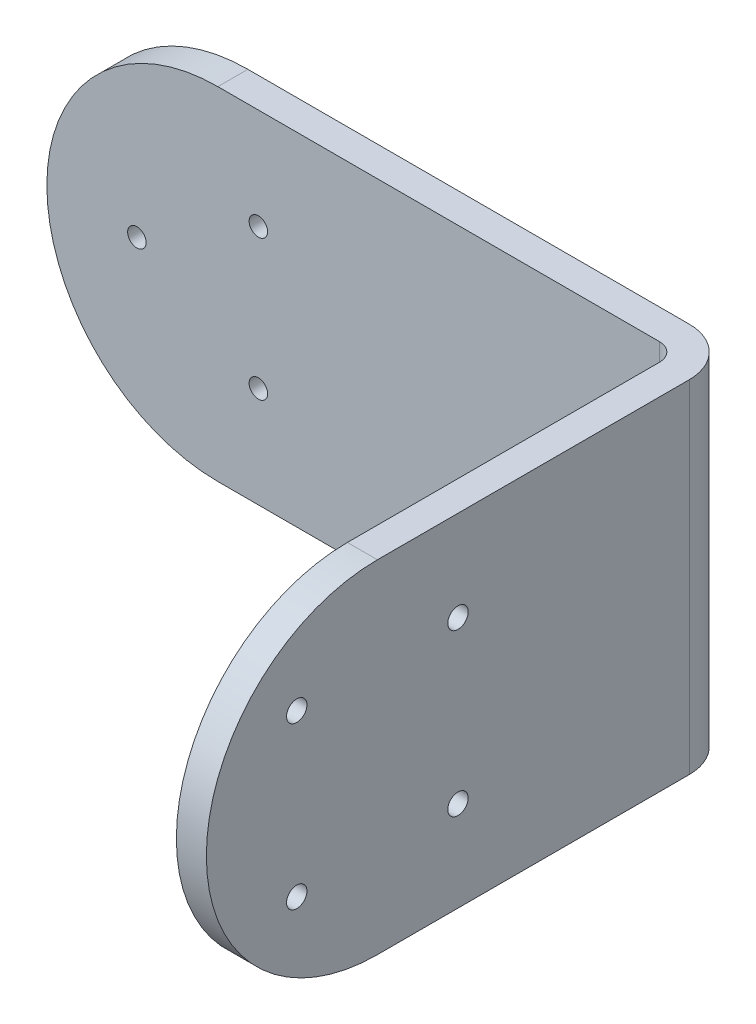
ISO-10303-21;
HEADER;
FILE_DESCRIPTION(('STEP AP214'),'2;1');
FILE_NAME('part.step','',(''),(''),'','','');
FILE_SCHEMA(('AUTOMOTIVE_DESIGN { 1 0 10303 214 1 1 1 1 }'));
ENDSEC;
DATA;
#1=APPLICATION_CONTEXT('core data for automotive mechanical design processes');
#2=APPLICATION_PROTOCOL_DEFINITION('international standard','automotive_design',2000,#1);
#3=PRODUCT_CONTEXT('',#1,'mechanical');
#4=PRODUCT('Part','Part','',(#3));
#5=PRODUCT_RELATED_PRODUCT_CATEGORY('part','',(#4));
#6=PRODUCT_DEFINITION_FORMATION('','',#4);
#7=PRODUCT_DEFINITION_CONTEXT('part definition',#1,'design');
#8=PRODUCT_DEFINITION('design','',#6,#7);
#9=PRODUCT_DEFINITION_SHAPE('','',#8);
#10=(LENGTH_UNIT() NAMED_UNIT(*) SI_UNIT(.MILLI.,.METRE.));
#11=(NAMED_UNIT(*) PLANE_ANGLE_UNIT() SI_UNIT($,.RADIAN.));
#12=(NAMED_UNIT(*) SI_UNIT($,.STERADIAN.) SOLID_ANGLE_UNIT());
#13=UNCERTAINTY_MEASURE_WITH_UNIT(LENGTH_MEASURE(1.E-05),#10,'distance_accuracy_value','');
#14=(GEOMETRIC_REPRESENTATION_CONTEXT(3) GLOBAL_UNCERTAINTY_ASSIGNED_CONTEXT((#13)) GLOBAL_UNIT_ASSIGNED_CONTEXT((#10,
#11,#12)) REPRESENTATION_CONTEXT('',''));
#15=CARTESIAN_POINT('',(0.,0.,0.));
#16=DIRECTION('',(0.,0.,1.));
#17=DIRECTION('',(1.,0.,0.));
#18=AXIS2_PLACEMENT_3D('',#15,#16,#17);
#19=CARTESIAN_POINT('',(0.,0.,5.));
#20=DIRECTION('',(0.,0.,1.));
#21=DIRECTION('',(1.,0.,0.));
#22=AXIS2_PLACEMENT_3D('',#19,#20,#21);
#23=PLANE('',#22);
#24=CARTESIAN_POINT('',(6.74999999999997,11.6913429510899,5.));
#25=DIRECTION('',(0.,0.,1.));
#26=DIRECTION('',(1.,0.,0.));
#27=AXIS2_PLACEMENT_3D('',#24,#25,#26);
#28=CIRCLE('',#27,1.54);
#29=CARTESIAN_POINT('',(8.28999999999997,11.6913429510899,5.));
#30=VERTEX_POINT('',#29);
#31=EDGE_CURVE('E165',#30,#30,#28,.T.);
#32=ORIENTED_EDGE('',*,*,#31,.F.);
#33=EDGE_LOOP('',(#32));
#34=FACE_BOUND('',#33,.T.);
#35=DIRECTION('',(1.,0.,0.));
#36=VECTOR('',#35,1.);
#37=CARTESIAN_POINT('',(0.,-28.5,5.));
#38=LINE('',#37,#36);
#39=CARTESIAN_POINT('',(0.,-28.5,5.));
#40=VERTEX_POINT('',#39);
#41=CARTESIAN_POINT('',(73.583465403301,-28.5,5.));
#42=VERTEX_POINT('',#41);
#43=EDGE_CURVE('E183',#40,#42,#38,.T.);
#44=ORIENTED_EDGE('',*,*,#43,.T.);
#45=DIRECTION('',(0.,1.,0.));
#46=VECTOR('',#45,1.);
#47=CARTESIAN_POINT('',(73.583465403301,0.,5.));
#48=LINE('',#47,#46);
#49=CARTESIAN_POINT('',(73.583465403301,28.5,5.));
#50=VERTEX_POINT('',#49);
#51=EDGE_CURVE('E218',#42,#50,#48,.T.);
#52=ORIENTED_EDGE('',*,*,#51,.T.);
#53=DIRECTION('',(-1.,0.,0.));
#54=VECTOR('',#53,1.);
#55=CARTESIAN_POINT('',(76.583465403301,28.5,5.));
#56=LINE('',#55,#54);
#57=CARTESIAN_POINT('',(0.,28.5,5.));
#58=VERTEX_POINT('',#57);
#59=EDGE_CURVE('E187',#50,#58,#56,.T.);
#60=ORIENTED_EDGE('',*,*,#59,.T.);
#61=CARTESIAN_POINT('',(0.,0.,5.));
#62=DIRECTION('',(0.,0.,1.));
#63=DIRECTION('',(1.,0.,0.));
#64=AXIS2_PLACEMENT_3D('',#61,#62,#63);
#65=CIRCLE('',#64,28.5);
#66=EDGE_CURVE('E179',#58,#40,#65,.T.);
#67=ORIENTED_EDGE('',*,*,#66,.T.);
#68=EDGE_LOOP('',(#44,#52,#60,#67));
#69=FACE_BOUND('',#68,.T.);
#70=CARTESIAN_POINT('',(-13.5,0.,5.));
#71=DIRECTION('',(0.,0.,1.));
#72=DIRECTION('',(1.,0.,0.));
#73=AXIS2_PLACEMENT_3D('',#70,#71,#72);
#74=CIRCLE('',#73,1.54);
#75=CARTESIAN_POINT('',(-11.96,0.,5.));
#76=VERTEX_POINT('',#75);
#77=EDGE_CURVE('E172',#76,#76,#74,.T.);
#78=ORIENTED_EDGE('',*,*,#77,.F.);
#79=EDGE_LOOP('',(#78));
#80=FACE_BOUND('',#79,.T.);
#81=CARTESIAN_POINT('',(6.75000000000014,-11.6913429510898,5.));
#82=DIRECTION('',(0.,0.,1.));
#83=DIRECTION('',(1.,0.,0.));
#84=AXIS2_PLACEMENT_3D('',#81,#82,#83);
#85=CIRCLE('',#84,1.54);
#86=CARTESIAN_POINT('',(8.29000000000013,-11.6913429510898,5.));
#87=VERTEX_POINT('',#86);
#88=EDGE_CURVE('E157',#87,#87,#85,.T.);
#89=ORIENTED_EDGE('',*,*,#88,.F.);
#90=EDGE_LOOP('',(#89));
#91=FACE_BOUND('',#90,.T.);
#92=ADVANCED_FACE('F47',(#34,#69,#80,#91),#23,.T.);
#93=CARTESIAN_POINT('',(0.,0.,0.));
#94=DIRECTION('',(0.,0.,1.));
#95=DIRECTION('',(1.,0.,0.));
#96=AXIS2_PLACEMENT_3D('',#93,#94,#95);
#97=PLANE('',#96);
#98=DIRECTION('',(-1.,0.,0.));
#99=VECTOR('',#98,1.);
#100=CARTESIAN_POINT('',(76.583465403301,28.5,0.));
#101=LINE('',#100,#99);
#102=CARTESIAN_POINT('',(73.583465403301,28.5,0.));
#103=VERTEX_POINT('',#102);
#104=CARTESIAN_POINT('',(0.,28.5,0.));
#105=VERTEX_POINT('',#104);
#106=EDGE_CURVE('E184',#103,#105,#101,.T.);
#107=ORIENTED_EDGE('',*,*,#106,.F.);
#108=DIRECTION('',(0.,1.,0.));
#109=VECTOR('',#108,1.);
#110=CARTESIAN_POINT('',(73.583465403301,-28.5,0.));
#111=LINE('',#110,#109);
#112=CARTESIAN_POINT('',(73.583465403301,-28.5,0.));
#113=VERTEX_POINT('',#112);
#114=EDGE_CURVE('E212',#103,#113,#111,.F.);
#115=ORIENTED_EDGE('',*,*,#114,.T.);
#116=DIRECTION('',(1.,0.,0.));
#117=VECTOR('',#116,1.);
#118=CARTESIAN_POINT('',(0.,-28.5,0.));
#119=LINE('',#118,#117);
#120=CARTESIAN_POINT('',(0.,-28.5,0.));
#121=VERTEX_POINT('',#120);
#122=EDGE_CURVE('E194',#121,#113,#119,.T.);
#123=ORIENTED_EDGE('',*,*,#122,.F.);
#124=CARTESIAN_POINT('',(0.,0.,0.));
#125=DIRECTION('',(0.,0.,1.));
#126=DIRECTION('',(1.,0.,0.));
#127=AXIS2_PLACEMENT_3D('',#124,#125,#126);
#128=CIRCLE('',#127,28.5);
#129=EDGE_CURVE('E175',#105,#121,#128,.T.);
#130=ORIENTED_EDGE('',*,*,#129,.F.);
#131=EDGE_LOOP('',(#107,#115,#123,#130));
#132=FACE_BOUND('',#131,.T.);
#133=CARTESIAN_POINT('',(-13.5,0.,0.));
#134=DIRECTION('',(0.,0.,1.));
#135=DIRECTION('',(1.,0.,0.));
#136=AXIS2_PLACEMENT_3D('',#133,#134,#135);
#137=CIRCLE('',#136,1.54);
#138=CARTESIAN_POINT('',(-11.96,0.,0.));
#139=VERTEX_POINT('',#138);
#140=EDGE_CURVE('E168',#139,#139,#137,.T.);
#141=ORIENTED_EDGE('',*,*,#140,.T.);
#142=EDGE_LOOP('',(#141));
#143=FACE_BOUND('',#142,.T.);
#144=CARTESIAN_POINT('',(6.74999999999997,11.6913429510899,0.));
#145=DIRECTION('',(0.,0.,1.));
#146=DIRECTION('',(1.,0.,0.));
#147=AXIS2_PLACEMENT_3D('',#144,#145,#146);
#148=CIRCLE('',#147,1.54);
#149=CARTESIAN_POINT('',(8.28999999999997,11.6913429510899,0.));
#150=VERTEX_POINT('',#149);
#151=EDGE_CURVE('E161',#150,#150,#148,.T.);
#152=ORIENTED_EDGE('',*,*,#151,.T.);
#153=EDGE_LOOP('',(#152));
#154=FACE_BOUND('',#153,.T.);
#155=CARTESIAN_POINT('',(6.75000000000014,-11.6913429510898,0.));
#156=DIRECTION('',(0.,0.,1.));
#157=DIRECTION('',(1.,0.,0.));
#158=AXIS2_PLACEMENT_3D('',#155,#156,#157);
#159=CIRCLE('',#158,1.54);
#160=CARTESIAN_POINT('',(8.29000000000013,-11.6913429510898,0.));
#161=VERTEX_POINT('',#160);
#162=EDGE_CURVE('E134',#161,#161,#159,.T.);
#163=ORIENTED_EDGE('',*,*,#162,.T.);
#164=EDGE_LOOP('',(#163));
#165=FACE_BOUND('',#164,.T.);
#166=ADVANCED_FACE('F241',(#132,#143,#154,#165),#97,.F.);
#167=CARTESIAN_POINT('',(0.,0.,5.));
#168=DIRECTION('',(0.,0.,-1.));
#169=DIRECTION('',(-1.,0.,0.));
#170=AXIS2_PLACEMENT_3D('',#167,#168,#169);
#171=CYLINDRICAL_SURFACE('',#170,28.5);
#172=ORIENTED_EDGE('',*,*,#129,.T.);
#173=DIRECTION('',(0.,0.,-1.));
#174=VECTOR('',#173,1.);
#175=CARTESIAN_POINT('',(0.,-28.5,5.));
#176=LINE('',#175,#174);
#177=EDGE_CURVE('E203',#40,#121,#176,.T.);
#178=ORIENTED_EDGE('',*,*,#177,.F.);
#179=ORIENTED_EDGE('',*,*,#66,.F.);
#180=DIRECTION('',(0.,0.,-1.));
#181=VECTOR('',#180,1.);
#182=CARTESIAN_POINT('',(0.,28.5,5.));
#183=LINE('',#182,#181);
#184=EDGE_CURVE('E190',#58,#105,#183,.T.);
#185=ORIENTED_EDGE('',*,*,#184,.T.);
#186=EDGE_LOOP('',(#172,#178,#179,#185));
#187=FACE_BOUND('',#186,.T.);
#188=ADVANCED_FACE('F238',(#187),#171,.T.);
#189=CARTESIAN_POINT('',(0.,-28.5,5.));
#190=DIRECTION('',(0.,1.,0.));
#191=DIRECTION('',(0.,0.,1.));
#192=AXIS2_PLACEMENT_3D('',#189,#190,#191);
#193=PLANE('',#192);
#194=ORIENTED_EDGE('',*,*,#122,.T.);
#195=CARTESIAN_POINT('',(73.583465403301,-28.5,8.));
#196=DIRECTION('',(0.,1.,0.));
#197=DIRECTION('',(0.,0.,1.));
#198=AXIS2_PLACEMENT_3D('',#195,#196,#197);
#199=CIRCLE('',#198,8.);
#200=CARTESIAN_POINT('',(81.583465403301,-28.5,8.));
#201=VERTEX_POINT('',#200);
#202=EDGE_CURVE('E215',#113,#201,#199,.F.);
#203=ORIENTED_EDGE('',*,*,#202,.T.);
#204=DIRECTION('',(0.,0.,-1.));
#205=VECTOR('',#204,1.);
#206=CARTESIAN_POINT('',(81.583465403301,-28.5,0.));
#207=LINE('',#206,#205);
#208=CARTESIAN_POINT('',(81.583465403301,-28.5,60.));
#209=VERTEX_POINT('',#208);
#210=EDGE_CURVE('E125',#209,#201,#207,.T.);
#211=ORIENTED_EDGE('',*,*,#210,.F.);
#212=DIRECTION('',(-1.,0.,0.));
#213=VECTOR('',#212,1.);
#214=CARTESIAN_POINT('',(81.583465403301,-28.5,60.));
#215=LINE('',#214,#213);
#216=CARTESIAN_POINT('',(76.583465403301,-28.5,60.));
#217=VERTEX_POINT('',#216);
#218=EDGE_CURVE('E135',#209,#217,#215,.T.);
#219=ORIENTED_EDGE('',*,*,#218,.T.);
#220=DIRECTION('',(0.,0.,-1.));
#221=VECTOR('',#220,1.);
#222=CARTESIAN_POINT('',(76.583465403301,-28.5,0.));
#223=LINE('',#222,#221);
#224=CARTESIAN_POINT('',(76.583465403301,-28.5,8.));
#225=VERTEX_POINT('',#224);
#226=EDGE_CURVE('E148',#217,#225,#223,.T.);
#227=ORIENTED_EDGE('',*,*,#226,.T.);
#228=CARTESIAN_POINT('',(73.583465403301,-28.5,8.));
#229=DIRECTION('',(0.,1.,0.));
#230=DIRECTION('',(0.,0.,1.));
#231=AXIS2_PLACEMENT_3D('',#228,#229,#230);
#232=CIRCLE('',#231,3.);
#233=EDGE_CURVE('E12',#225,#42,#232,.T.);
#234=ORIENTED_EDGE('',*,*,#233,.T.);
#235=ORIENTED_EDGE('',*,*,#43,.F.);
#236=ORIENTED_EDGE('',*,*,#177,.T.);
#237=EDGE_LOOP('',(#194,#203,#211,#219,#227,#234,#235,#236));
#238=FACE_BOUND('',#237,.T.);
#239=ADVANCED_FACE('F234',(#238),#193,.F.);
#240=CARTESIAN_POINT('',(76.583465403301,28.5,5.));
#241=DIRECTION('',(0.,-1.,0.));
#242=DIRECTION('',(1.,0.,0.));
#243=AXIS2_PLACEMENT_3D('',#240,#241,#242);
#244=PLANE('',#243);
#245=DIRECTION('',(0.,0.,1.));
#246=VECTOR('',#245,1.);
#247=CARTESIAN_POINT('',(81.583465403301,28.5,0.));
#248=LINE('',#247,#246);
#249=CARTESIAN_POINT('',(81.583465403301,28.5,8.));
#250=VERTEX_POINT('',#249);
#251=CARTESIAN_POINT('',(81.583465403301,28.5,60.));
#252=VERTEX_POINT('',#251);
#253=EDGE_CURVE('E113',#250,#252,#248,.T.);
#254=ORIENTED_EDGE('',*,*,#253,.F.);
#255=CARTESIAN_POINT('',(73.583465403301,28.5,8.));
#256=DIRECTION('',(0.,-1.,0.));
#257=DIRECTION('',(1.,0.,0.));
#258=AXIS2_PLACEMENT_3D('',#255,#256,#257);
#259=CIRCLE('',#258,8.);
#260=EDGE_CURVE('E209',#250,#103,#259,.F.);
#261=ORIENTED_EDGE('',*,*,#260,.T.);
#262=ORIENTED_EDGE('',*,*,#106,.T.);
#263=ORIENTED_EDGE('',*,*,#184,.F.);
#264=ORIENTED_EDGE('',*,*,#59,.F.);
#265=CARTESIAN_POINT('',(73.583465403301,28.5,8.));
#266=DIRECTION('',(0.,-1.,0.));
#267=DIRECTION('',(1.,0.,0.));
#268=AXIS2_PLACEMENT_3D('',#265,#266,#267);
#269=CIRCLE('',#268,3.);
#270=CARTESIAN_POINT('',(76.583465403301,28.5,8.));
#271=VERTEX_POINT('',#270);
#272=EDGE_CURVE('E56',#50,#271,#269,.T.);
#273=ORIENTED_EDGE('',*,*,#272,.T.);
#274=DIRECTION('',(0.,0.,1.));
#275=VECTOR('',#274,1.);
#276=CARTESIAN_POINT('',(76.583465403301,28.5,0.));
#277=LINE('',#276,#275);
#278=CARTESIAN_POINT('',(76.583465403301,28.5,60.));
#279=VERTEX_POINT('',#278);
#280=EDGE_CURVE('E130',#271,#279,#277,.T.);
#281=ORIENTED_EDGE('',*,*,#280,.T.);
#282=DIRECTION('',(-1.,0.,0.));
#283=VECTOR('',#282,1.);
#284=CARTESIAN_POINT('',(81.583465403301,28.5,60.));
#285=LINE('',#284,#283);
#286=EDGE_CURVE('E128',#252,#279,#285,.T.);
#287=ORIENTED_EDGE('',*,*,#286,.F.);
#288=EDGE_LOOP('',(#254,#261,#262,#263,#264,#273,#281,#287));
#289=FACE_BOUND('',#288,.T.);
#290=ADVANCED_FACE('F129',(#289),#244,.F.);
#291=CARTESIAN_POINT('',(-13.5,0.,5.));
#292=DIRECTION('',(0.,0.,-1.));
#293=DIRECTION('',(-1.,0.,0.));
#294=AXIS2_PLACEMENT_3D('',#291,#292,#293);
#295=CYLINDRICAL_SURFACE('',#294,1.54);
#296=ORIENTED_EDGE('',*,*,#77,.T.);
#297=EDGE_LOOP('',(#296));
#298=FACE_BOUND('',#297,.T.);
#299=ORIENTED_EDGE('',*,*,#140,.F.);
#300=EDGE_LOOP('',(#299));
#301=FACE_BOUND('',#300,.T.);
#302=ADVANCED_FACE('F305',(#298,#301),#295,.F.);
#303=CARTESIAN_POINT('',(6.74999999999997,11.6913429510899,5.));
#304=DIRECTION('',(0.,0.,-1.));
#305=DIRECTION('',(-1.,0.,0.));
#306=AXIS2_PLACEMENT_3D('',#303,#304,#305);
#307=CYLINDRICAL_SURFACE('',#306,1.54);
#308=ORIENTED_EDGE('',*,*,#31,.T.);
#309=EDGE_LOOP('',(#308));
#310=FACE_BOUND('',#309,.T.);
#311=ORIENTED_EDGE('',*,*,#151,.F.);
#312=EDGE_LOOP('',(#311));
#313=FACE_BOUND('',#312,.T.);
#314=ADVANCED_FACE('F291',(#310,#313),#307,.F.);
#315=CARTESIAN_POINT('',(6.75000000000014,-11.6913429510898,5.));
#316=DIRECTION('',(0.,0.,-1.));
#317=DIRECTION('',(-1.,0.,0.));
#318=AXIS2_PLACEMENT_3D('',#315,#316,#317);
#319=CYLINDRICAL_SURFACE('',#318,1.54);
#320=ORIENTED_EDGE('',*,*,#88,.T.);
#321=EDGE_LOOP('',(#320));
#322=FACE_BOUND('',#321,.T.);
#323=ORIENTED_EDGE('',*,*,#162,.F.);
#324=EDGE_LOOP('',(#323));
#325=FACE_BOUND('',#324,.T.);
#326=ADVANCED_FACE('F284',(#322,#325),#319,.F.);
#327=CARTESIAN_POINT('',(81.583465403301,0.,60.));
#328=DIRECTION('',(1.,0.,0.));
#329=DIRECTION('',(0.,0.,-1.));
#330=AXIS2_PLACEMENT_3D('',#327,#328,#329);
#331=PLANE('',#330);
#332=CARTESIAN_POINT('',(81.583465403301,13.4350288425444,46.5649711574556));
#333=DIRECTION('',(1.,0.,0.));
#334=DIRECTION('',(0.,0.,-1.));
#335=AXIS2_PLACEMENT_3D('',#332,#333,#334);
#336=CIRCLE('',#335,1.7);
#337=CARTESIAN_POINT('',(81.583465403301,13.4350288425444,44.8649711574556));
#338=VERTEX_POINT('',#337);
#339=EDGE_CURVE('E260',#338,#338,#336,.T.);
#340=ORIENTED_EDGE('',*,*,#339,.F.);
#341=EDGE_LOOP('',(#340));
#342=FACE_BOUND('',#341,.T.);
#343=CARTESIAN_POINT('',(81.583465403301,-13.4350288425444,73.4350288425444));
#344=DIRECTION('',(1.,0.,0.));
#345=DIRECTION('',(0.,0.,-1.));
#346=AXIS2_PLACEMENT_3D('',#343,#344,#345);
#347=CIRCLE('',#346,1.7);
#348=CARTESIAN_POINT('',(81.583465403301,-13.4350288425444,71.7350288425444));
#349=VERTEX_POINT('',#348);
#350=EDGE_CURVE('E151',#349,#349,#347,.T.);
#351=ORIENTED_EDGE('',*,*,#350,.F.);
#352=EDGE_LOOP('',(#351));
#353=FACE_BOUND('',#352,.T.);
#354=ORIENTED_EDGE('',*,*,#210,.T.);
#355=DIRECTION('',(0.,1.,0.));
#356=VECTOR('',#355,1.);
#357=CARTESIAN_POINT('',(81.583465403301,28.5,8.));
#358=LINE('',#357,#356);
#359=EDGE_CURVE('E122',#201,#250,#358,.T.);
#360=ORIENTED_EDGE('',*,*,#359,.T.);
#361=ORIENTED_EDGE('',*,*,#253,.T.);
#362=CARTESIAN_POINT('',(81.583465403301,0.,60.));
#363=DIRECTION('',(1.,0.,0.));
#364=DIRECTION('',(0.,0.,-1.));
#365=AXIS2_PLACEMENT_3D('',#362,#363,#364);
#366=CIRCLE('',#365,28.5);
#367=EDGE_CURVE('E119',#252,#209,#366,.T.);
#368=ORIENTED_EDGE('',*,*,#367,.T.);
#369=EDGE_LOOP('',(#354,#360,#361,#368));
#370=FACE_BOUND('',#369,.T.);
#371=CARTESIAN_POINT('',(81.583465403301,13.4350288425445,73.4350288425443));
#372=DIRECTION('',(1.,0.,0.));
#373=DIRECTION('',(0.,0.,-1.));
#374=AXIS2_PLACEMENT_3D('',#371,#372,#373);
#375=CIRCLE('',#374,1.7);
#376=CARTESIAN_POINT('',(81.583465403301,13.4350288425445,71.7350288425443));
#377=VERTEX_POINT('',#376);
#378=EDGE_CURVE('E252',#377,#377,#375,.T.);
#379=ORIENTED_EDGE('',*,*,#378,.F.);
#380=EDGE_LOOP('',(#379));
#381=FACE_BOUND('',#380,.T.);
#382=CARTESIAN_POINT('',(81.583465403301,-13.4350288425446,46.5649711574558));
#383=DIRECTION('',(1.,0.,0.));
#384=DIRECTION('',(0.,0.,-1.));
#385=AXIS2_PLACEMENT_3D('',#382,#383,#384);
#386=CIRCLE('',#385,1.7);
#387=CARTESIAN_POINT('',(81.583465403301,-13.4350288425446,44.8649711574558));
#388=VERTEX_POINT('',#387);
#389=EDGE_CURVE('E268',#388,#388,#386,.T.);
#390=ORIENTED_EDGE('',*,*,#389,.F.);
#391=EDGE_LOOP('',(#390));
#392=FACE_BOUND('',#391,.T.);
#393=ADVANCED_FACE('F116',(#342,#353,#370,#381,#392),#331,.T.);
#394=CARTESIAN_POINT('',(76.583465403301,0.,60.));
#395=DIRECTION('',(1.,0.,0.));
#396=DIRECTION('',(0.,0.,-1.));
#397=AXIS2_PLACEMENT_3D('',#394,#395,#396);
#398=PLANE('',#397);
#399=ORIENTED_EDGE('',*,*,#280,.F.);
#400=DIRECTION('',(0.,1.,0.));
#401=VECTOR('',#400,1.);
#402=CARTESIAN_POINT('',(76.583465403301,0.,8.));
#403=LINE('',#402,#401);
#404=EDGE_CURVE('E69',#271,#225,#403,.F.);
#405=ORIENTED_EDGE('',*,*,#404,.T.);
#406=ORIENTED_EDGE('',*,*,#226,.F.);
#407=CARTESIAN_POINT('',(76.583465403301,0.,60.));
#408=DIRECTION('',(1.,0.,0.));
#409=DIRECTION('',(0.,0.,-1.));
#410=AXIS2_PLACEMENT_3D('',#407,#408,#409);
#411=CIRCLE('',#410,28.5);
#412=EDGE_CURVE('E154',#279,#217,#411,.T.);
#413=ORIENTED_EDGE('',*,*,#412,.F.);
#414=EDGE_LOOP('',(#399,#405,#406,#413));
#415=FACE_BOUND('',#414,.T.);
#416=CARTESIAN_POINT('',(76.583465403301,-13.4350288425444,73.4350288425444));
#417=DIRECTION('',(1.,0.,0.));
#418=DIRECTION('',(0.,0.,-1.));
#419=AXIS2_PLACEMENT_3D('',#416,#417,#418);
#420=CIRCLE('',#419,1.7);
#421=CARTESIAN_POINT('',(76.583465403301,-13.4350288425444,71.7350288425444));
#422=VERTEX_POINT('',#421);
#423=EDGE_CURVE('E248',#422,#422,#420,.T.);
#424=ORIENTED_EDGE('',*,*,#423,.T.);
#425=EDGE_LOOP('',(#424));
#426=FACE_BOUND('',#425,.T.);
#427=CARTESIAN_POINT('',(76.583465403301,13.4350288425445,73.4350288425443));
#428=DIRECTION('',(1.,0.,0.));
#429=DIRECTION('',(0.,0.,-1.));
#430=AXIS2_PLACEMENT_3D('',#427,#428,#429);
#431=CIRCLE('',#430,1.7);
#432=CARTESIAN_POINT('',(76.583465403301,13.4350288425445,71.7350288425443));
#433=VERTEX_POINT('',#432);
#434=EDGE_CURVE('E256',#433,#433,#431,.T.);
#435=ORIENTED_EDGE('',*,*,#434,.T.);
#436=EDGE_LOOP('',(#435));
#437=FACE_BOUND('',#436,.T.);
#438=CARTESIAN_POINT('',(76.583465403301,13.4350288425444,46.5649711574556));
#439=DIRECTION('',(1.,0.,0.));
#440=DIRECTION('',(0.,0.,-1.));
#441=AXIS2_PLACEMENT_3D('',#438,#439,#440);
#442=CIRCLE('',#441,1.7);
#443=CARTESIAN_POINT('',(76.583465403301,13.4350288425444,44.8649711574556));
#444=VERTEX_POINT('',#443);
#445=EDGE_CURVE('E264',#444,#444,#442,.T.);
#446=ORIENTED_EDGE('',*,*,#445,.T.);
#447=EDGE_LOOP('',(#446));
#448=FACE_BOUND('',#447,.T.);
#449=CARTESIAN_POINT('',(76.583465403301,-13.4350288425446,46.5649711574558));
#450=DIRECTION('',(1.,0.,0.));
#451=DIRECTION('',(0.,0.,-1.));
#452=AXIS2_PLACEMENT_3D('',#449,#450,#451);
#453=CIRCLE('',#452,1.7);
#454=CARTESIAN_POINT('',(76.583465403301,-13.4350288425446,44.8649711574558));
#455=VERTEX_POINT('',#454);
#456=EDGE_CURVE('E272',#455,#455,#453,.T.);
#457=ORIENTED_EDGE('',*,*,#456,.T.);
#458=EDGE_LOOP('',(#457));
#459=FACE_BOUND('',#458,.T.);
#460=ADVANCED_FACE('F228',(#415,#426,#437,#448,#459),#398,.F.);
#461=CARTESIAN_POINT('',(81.583465403301,0.,60.));
#462=DIRECTION('',(-1.,0.,0.));
#463=DIRECTION('',(0.,0.,1.));
#464=AXIS2_PLACEMENT_3D('',#461,#462,#463);
#465=CYLINDRICAL_SURFACE('',#464,28.5);
#466=ORIENTED_EDGE('',*,*,#412,.T.);
#467=ORIENTED_EDGE('',*,*,#218,.F.);
#468=ORIENTED_EDGE('',*,*,#367,.F.);
#469=ORIENTED_EDGE('',*,*,#286,.T.);
#470=EDGE_LOOP('',(#466,#467,#468,#469));
#471=FACE_BOUND('',#470,.T.);
#472=ADVANCED_FACE('F137',(#471),#465,.T.);
#473=CARTESIAN_POINT('',(81.583465403301,-13.4350288425444,73.4350288425444));
#474=DIRECTION('',(-1.,0.,0.));
#475=DIRECTION('',(0.,0.,1.));
#476=AXIS2_PLACEMENT_3D('',#473,#474,#475);
#477=CYLINDRICAL_SURFACE('',#476,1.7);
#478=ORIENTED_EDGE('',*,*,#350,.T.);
#479=EDGE_LOOP('',(#478));
#480=FACE_BOUND('',#479,.T.);
#481=ORIENTED_EDGE('',*,*,#423,.F.);
#482=EDGE_LOOP('',(#481));
#483=FACE_BOUND('',#482,.T.);
#484=ADVANCED_FACE('F326',(#480,#483),#477,.F.);
#485=CARTESIAN_POINT('',(81.583465403301,13.4350288425445,73.4350288425443));
#486=DIRECTION('',(-1.,0.,0.));
#487=DIRECTION('',(0.,0.,1.));
#488=AXIS2_PLACEMENT_3D('',#485,#486,#487);
#489=CYLINDRICAL_SURFACE('',#488,1.7);
#490=ORIENTED_EDGE('',*,*,#378,.T.);
#491=EDGE_LOOP('',(#490));
#492=FACE_BOUND('',#491,.T.);
#493=ORIENTED_EDGE('',*,*,#434,.F.);
#494=EDGE_LOOP('',(#493));
#495=FACE_BOUND('',#494,.T.);
#496=ADVANCED_FACE('F321',(#492,#495),#489,.F.);
#497=CARTESIAN_POINT('',(81.583465403301,13.4350288425444,46.5649711574556));
#498=DIRECTION('',(-1.,0.,0.));
#499=DIRECTION('',(0.,0.,1.));
#500=AXIS2_PLACEMENT_3D('',#497,#498,#499);
#501=CYLINDRICAL_SURFACE('',#500,1.7);
#502=ORIENTED_EDGE('',*,*,#339,.T.);
#503=EDGE_LOOP('',(#502));
#504=FACE_BOUND('',#503,.T.);
#505=ORIENTED_EDGE('',*,*,#445,.F.);
#506=EDGE_LOOP('',(#505));
#507=FACE_BOUND('',#506,.T.);
#508=ADVANCED_FACE('F317',(#504,#507),#501,.F.);
#509=CARTESIAN_POINT('',(81.583465403301,-13.4350288425446,46.5649711574558));
#510=DIRECTION('',(-1.,0.,0.));
#511=DIRECTION('',(0.,0.,1.));
#512=AXIS2_PLACEMENT_3D('',#509,#510,#511);
#513=CYLINDRICAL_SURFACE('',#512,1.7);
#514=ORIENTED_EDGE('',*,*,#389,.T.);
#515=EDGE_LOOP('',(#514));
#516=FACE_BOUND('',#515,.T.);
#517=ORIENTED_EDGE('',*,*,#456,.F.);
#518=EDGE_LOOP('',(#517));
#519=FACE_BOUND('',#518,.T.);
#520=ADVANCED_FACE('F280',(#516,#519),#513,.F.);
#521=CARTESIAN_POINT('',(73.583465403301,0.,8.));
#522=DIRECTION('',(0.,-1.,0.));
#523=DIRECTION('',(0.,0.,-1.));
#524=AXIS2_PLACEMENT_3D('',#521,#522,#523);
#525=CYLINDRICAL_SURFACE('',#524,8.);
#526=ORIENTED_EDGE('',*,*,#202,.F.);
#527=ORIENTED_EDGE('',*,*,#114,.F.);
#528=ORIENTED_EDGE('',*,*,#260,.F.);
#529=ORIENTED_EDGE('',*,*,#359,.F.);
#530=EDGE_LOOP('',(#526,#527,#528,#529));
#531=FACE_BOUND('',#530,.T.);
#532=ADVANCED_FACE('F245',(#531),#525,.T.);
#533=CARTESIAN_POINT('',(73.583465403301,0.,8.));
#534=DIRECTION('',(0.,1.,0.));
#535=DIRECTION('',(0.,0.,1.));
#536=AXIS2_PLACEMENT_3D('',#533,#534,#535);
#537=CYLINDRICAL_SURFACE('',#536,3.);
#538=ORIENTED_EDGE('',*,*,#233,.F.);
#539=ORIENTED_EDGE('',*,*,#404,.F.);
#540=ORIENTED_EDGE('',*,*,#272,.F.);
#541=ORIENTED_EDGE('',*,*,#51,.F.);
#542=EDGE_LOOP('',(#538,#539,#540,#541));
#543=FACE_BOUND('',#542,.T.);
#544=ADVANCED_FACE('F49',(#543),#537,.F.);
#545=CLOSED_SHELL('',(#92,#166,#188,#239,#290,#302,#314,#326,#393,#460,#472,#484,#496,#508,#520,
#532,#544));
#546=MANIFOLD_SOLID_BREP('B2',#545);
#547=ADVANCED_BREP_SHAPE_REPRESENTATION('',(#18,#546),#14);
#548=SHAPE_DEFINITION_REPRESENTATION(#9,#547);
ENDSEC;
END-ISO-10303-21;
